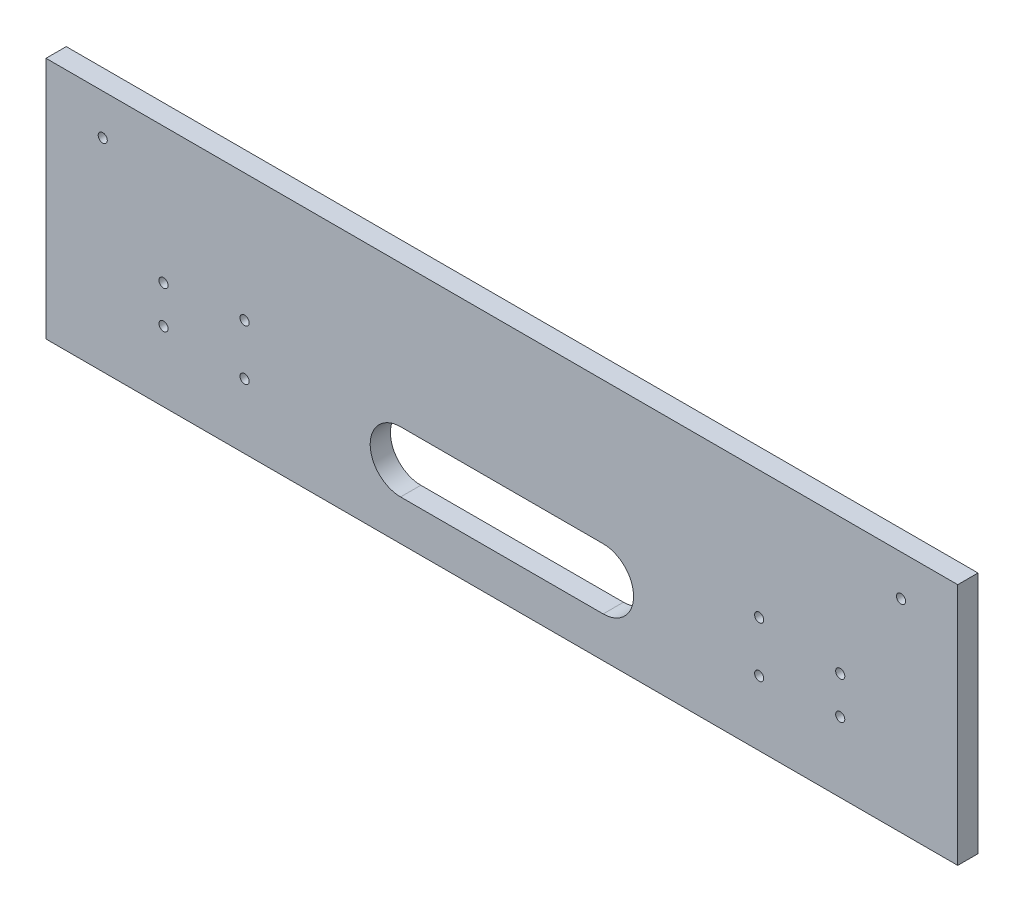
ISO-10303-21;
HEADER;
FILE_DESCRIPTION(('STEP AP214'),'2;1');
FILE_NAME('part.step','',(''),(''),'','','');
FILE_SCHEMA(('AUTOMOTIVE_DESIGN { 1 0 10303 214 1 1 1 1 }'));
ENDSEC;
DATA;
#1=APPLICATION_CONTEXT('core data for automotive mechanical design processes');
#2=APPLICATION_PROTOCOL_DEFINITION('international standard','automotive_design',2000,#1);
#3=PRODUCT_CONTEXT('',#1,'mechanical');
#4=PRODUCT('Part','Part','',(#3));
#5=PRODUCT_RELATED_PRODUCT_CATEGORY('part','',(#4));
#6=PRODUCT_DEFINITION_FORMATION('','',#4);
#7=PRODUCT_DEFINITION_CONTEXT('part definition',#1,'design');
#8=PRODUCT_DEFINITION('design','',#6,#7);
#9=PRODUCT_DEFINITION_SHAPE('','',#8);
#10=(LENGTH_UNIT() NAMED_UNIT(*) SI_UNIT(.MILLI.,.METRE.));
#11=(NAMED_UNIT(*) PLANE_ANGLE_UNIT() SI_UNIT($,.RADIAN.));
#12=(NAMED_UNIT(*) SI_UNIT($,.STERADIAN.) SOLID_ANGLE_UNIT());
#13=UNCERTAINTY_MEASURE_WITH_UNIT(LENGTH_MEASURE(1.E-05),#10,'distance_accuracy_value','');
#14=(GEOMETRIC_REPRESENTATION_CONTEXT(3) GLOBAL_UNCERTAINTY_ASSIGNED_CONTEXT((#13)) GLOBAL_UNIT_ASSIGNED_CONTEXT((#10,
#11,#12)) REPRESENTATION_CONTEXT('',''));
#15=CARTESIAN_POINT('',(0.,0.,0.));
#16=DIRECTION('',(0.,0.,1.));
#17=DIRECTION('',(1.,0.,0.));
#18=AXIS2_PLACEMENT_3D('',#15,#16,#17);
#19=CARTESIAN_POINT('',(-225.,60.,10.));
#20=DIRECTION('',(1.,0.,0.));
#21=DIRECTION('',(0.,0.,-1.));
#22=AXIS2_PLACEMENT_3D('',#19,#20,#21);
#23=PLANE('',#22);
#24=DIRECTION('',(0.,-1.,0.));
#25=VECTOR('',#24,1.);
#26=CARTESIAN_POINT('',(-225.,60.,0.));
#27=LINE('',#26,#25);
#28=CARTESIAN_POINT('',(-225.,60.,0.));
#29=VERTEX_POINT('',#28);
#30=CARTESIAN_POINT('',(-225.,-60.,0.));
#31=VERTEX_POINT('',#30);
#32=EDGE_CURVE('E142',#29,#31,#27,.T.);
#33=ORIENTED_EDGE('',*,*,#32,.T.);
#34=DIRECTION('',(0.,0.,-1.));
#35=VECTOR('',#34,1.);
#36=CARTESIAN_POINT('',(-225.,-60.,10.));
#37=LINE('',#36,#35);
#38=CARTESIAN_POINT('',(-225.,-60.,10.));
#39=VERTEX_POINT('',#38);
#40=EDGE_CURVE('E11',#39,#31,#37,.T.);
#41=ORIENTED_EDGE('',*,*,#40,.F.);
#42=DIRECTION('',(0.,-1.,0.));
#43=VECTOR('',#42,1.);
#44=CARTESIAN_POINT('',(-225.,60.,10.));
#45=LINE('',#44,#43);
#46=CARTESIAN_POINT('',(-225.,60.,10.));
#47=VERTEX_POINT('',#46);
#48=EDGE_CURVE('E146',#47,#39,#45,.T.);
#49=ORIENTED_EDGE('',*,*,#48,.F.);
#50=DIRECTION('',(0.,0.,-1.));
#51=VECTOR('',#50,1.);
#52=CARTESIAN_POINT('',(-225.,60.,10.));
#53=LINE('',#52,#51);
#54=EDGE_CURVE('E156',#47,#29,#53,.T.);
#55=ORIENTED_EDGE('',*,*,#54,.T.);
#56=EDGE_LOOP('',(#33,#41,#49,#55));
#57=FACE_BOUND('',#56,.T.);
#58=ADVANCED_FACE('F41',(#57),#23,.F.);
#59=CARTESIAN_POINT('',(-225.,-60.,10.));
#60=DIRECTION('',(0.,1.,0.));
#61=DIRECTION('',(0.,0.,1.));
#62=AXIS2_PLACEMENT_3D('',#59,#60,#61);
#63=PLANE('',#62);
#64=DIRECTION('',(1.,0.,0.));
#65=VECTOR('',#64,1.);
#66=CARTESIAN_POINT('',(-225.,-60.,0.));
#67=LINE('',#66,#65);
#68=CARTESIAN_POINT('',(225.,-60.,0.));
#69=VERTEX_POINT('',#68);
#70=EDGE_CURVE('E159',#31,#69,#67,.T.);
#71=ORIENTED_EDGE('',*,*,#70,.T.);
#72=DIRECTION('',(0.,0.,-1.));
#73=VECTOR('',#72,1.);
#74=CARTESIAN_POINT('',(225.,-60.,10.));
#75=LINE('',#74,#73);
#76=CARTESIAN_POINT('',(225.,-60.,10.));
#77=VERTEX_POINT('',#76);
#78=EDGE_CURVE('E48',#77,#69,#75,.T.);
#79=ORIENTED_EDGE('',*,*,#78,.F.);
#80=DIRECTION('',(1.,0.,0.));
#81=VECTOR('',#80,1.);
#82=CARTESIAN_POINT('',(-225.,-60.,10.));
#83=LINE('',#82,#81);
#84=EDGE_CURVE('E149',#39,#77,#83,.T.);
#85=ORIENTED_EDGE('',*,*,#84,.F.);
#86=ORIENTED_EDGE('',*,*,#40,.T.);
#87=EDGE_LOOP('',(#71,#79,#85,#86));
#88=FACE_BOUND('',#87,.T.);
#89=ADVANCED_FACE('F187',(#88),#63,.F.);
#90=CARTESIAN_POINT('',(225.,60.,10.));
#91=DIRECTION('',(-1.,0.,0.));
#92=DIRECTION('',(0.,-1.,0.));
#93=AXIS2_PLACEMENT_3D('',#90,#91,#92);
#94=PLANE('',#93);
#95=DIRECTION('',(0.,1.,0.));
#96=VECTOR('',#95,1.);
#97=CARTESIAN_POINT('',(225.,60.,0.));
#98=LINE('',#97,#96);
#99=CARTESIAN_POINT('',(225.,60.,0.));
#100=VERTEX_POINT('',#99);
#101=EDGE_CURVE('E161',#69,#100,#98,.T.);
#102=ORIENTED_EDGE('',*,*,#101,.T.);
#103=DIRECTION('',(0.,0.,-1.));
#104=VECTOR('',#103,1.);
#105=CARTESIAN_POINT('',(225.,60.,10.));
#106=LINE('',#105,#104);
#107=CARTESIAN_POINT('',(225.,60.,10.));
#108=VERTEX_POINT('',#107);
#109=EDGE_CURVE('E166',#108,#100,#106,.T.);
#110=ORIENTED_EDGE('',*,*,#109,.F.);
#111=DIRECTION('',(0.,1.,0.));
#112=VECTOR('',#111,1.);
#113=CARTESIAN_POINT('',(225.,60.,10.));
#114=LINE('',#113,#112);
#115=EDGE_CURVE('E152',#77,#108,#114,.T.);
#116=ORIENTED_EDGE('',*,*,#115,.F.);
#117=ORIENTED_EDGE('',*,*,#78,.T.);
#118=EDGE_LOOP('',(#102,#110,#116,#117));
#119=FACE_BOUND('',#118,.T.);
#120=ADVANCED_FACE('F173',(#119),#94,.F.);
#121=CARTESIAN_POINT('',(-225.,60.,10.));
#122=DIRECTION('',(0.,-1.,0.));
#123=DIRECTION('',(0.,0.,-1.));
#124=AXIS2_PLACEMENT_3D('',#121,#122,#123);
#125=PLANE('',#124);
#126=DIRECTION('',(-1.,0.,0.));
#127=VECTOR('',#126,1.);
#128=CARTESIAN_POINT('',(-225.,60.,0.));
#129=LINE('',#128,#127);
#130=EDGE_CURVE('E150',#100,#29,#129,.T.);
#131=ORIENTED_EDGE('',*,*,#130,.T.);
#132=ORIENTED_EDGE('',*,*,#54,.F.);
#133=DIRECTION('',(-1.,0.,0.));
#134=VECTOR('',#133,1.);
#135=CARTESIAN_POINT('',(-225.,60.,10.));
#136=LINE('',#135,#134);
#137=EDGE_CURVE('E154',#108,#47,#136,.T.);
#138=ORIENTED_EDGE('',*,*,#137,.F.);
#139=ORIENTED_EDGE('',*,*,#109,.T.);
#140=EDGE_LOOP('',(#131,#132,#138,#139));
#141=FACE_BOUND('',#140,.T.);
#142=ADVANCED_FACE('F182',(#141),#125,.F.);
#143=CARTESIAN_POINT('',(0.,0.,10.));
#144=DIRECTION('',(0.,0.,1.));
#145=DIRECTION('',(1.,0.,0.));
#146=AXIS2_PLACEMENT_3D('',#143,#144,#145);
#147=PLANE('',#146);
#148=CARTESIAN_POINT('',(-127.,-3.,10.));
#149=DIRECTION('',(0.,0.,-1.));
#150=DIRECTION('',(-1.,0.,0.));
#151=AXIS2_PLACEMENT_3D('',#148,#149,#150);
#152=CIRCLE('',#151,2.25000000000001);
#153=CARTESIAN_POINT('',(-129.25,-3.,10.));
#154=VERTEX_POINT('',#153);
#155=EDGE_CURVE('E279',#154,#154,#152,.T.);
#156=ORIENTED_EDGE('',*,*,#155,.T.);
#157=EDGE_LOOP('',(#156));
#158=FACE_BOUND('',#157,.T.);
#159=CARTESIAN_POINT('',(-127.,-28.,10.));
#160=DIRECTION('',(0.,0.,-1.));
#161=DIRECTION('',(-1.,0.,0.));
#162=AXIS2_PLACEMENT_3D('',#159,#160,#161);
#163=CIRCLE('',#162,2.25000000000001);
#164=CARTESIAN_POINT('',(-129.25,-28.,10.));
#165=VERTEX_POINT('',#164);
#166=EDGE_CURVE('E273',#165,#165,#163,.T.);
#167=ORIENTED_EDGE('',*,*,#166,.T.);
#168=EDGE_LOOP('',(#167));
#169=FACE_BOUND('',#168,.T.);
#170=CARTESIAN_POINT('',(127.,-28.,10.));
#171=DIRECTION('',(0.,0.,-1.));
#172=DIRECTION('',(-1.,0.,0.));
#173=AXIS2_PLACEMENT_3D('',#170,#171,#172);
#174=CIRCLE('',#173,2.25000000000001);
#175=CARTESIAN_POINT('',(124.75,-28.,10.));
#176=VERTEX_POINT('',#175);
#177=EDGE_CURVE('E258',#176,#176,#174,.T.);
#178=ORIENTED_EDGE('',*,*,#177,.T.);
#179=EDGE_LOOP('',(#178));
#180=FACE_BOUND('',#179,.T.);
#181=CARTESIAN_POINT('',(127.,-3.,10.));
#182=DIRECTION('',(0.,0.,-1.));
#183=DIRECTION('',(-1.,0.,0.));
#184=AXIS2_PLACEMENT_3D('',#181,#182,#183);
#185=CIRCLE('',#184,2.25000000000001);
#186=CARTESIAN_POINT('',(124.75,-3.,10.));
#187=VERTEX_POINT('',#186);
#188=EDGE_CURVE('E266',#187,#187,#185,.T.);
#189=ORIENTED_EDGE('',*,*,#188,.T.);
#190=EDGE_LOOP('',(#189));
#191=FACE_BOUND('',#190,.T.);
#192=CARTESIAN_POINT('',(-197.,40.0000000000001,10.));
#193=DIRECTION('',(0.,0.,1.));
#194=DIRECTION('',(1.,0.,0.));
#195=AXIS2_PLACEMENT_3D('',#192,#193,#194);
#196=CIRCLE('',#195,2.25000000000001);
#197=CARTESIAN_POINT('',(-194.75,40.0000000000001,10.));
#198=VERTEX_POINT('',#197);
#199=EDGE_CURVE('E298',#198,#198,#196,.T.);
#200=ORIENTED_EDGE('',*,*,#199,.F.);
#201=EDGE_LOOP('',(#200));
#202=FACE_BOUND('',#201,.T.);
#203=CARTESIAN_POINT('',(-167.,-25.5,10.));
#204=DIRECTION('',(0.,0.,1.));
#205=DIRECTION('',(1.,0.,0.));
#206=AXIS2_PLACEMENT_3D('',#203,#204,#205);
#207=CIRCLE('',#206,2.25000000000001);
#208=CARTESIAN_POINT('',(-164.75,-25.5,10.));
#209=VERTEX_POINT('',#208);
#210=EDGE_CURVE('E299',#209,#209,#207,.T.);
#211=ORIENTED_EDGE('',*,*,#210,.F.);
#212=EDGE_LOOP('',(#211));
#213=FACE_BOUND('',#212,.T.);
#214=CARTESIAN_POINT('',(167.,-6.99999999999991,10.));
#215=DIRECTION('',(0.,0.,1.));
#216=DIRECTION('',(1.,0.,0.));
#217=AXIS2_PLACEMENT_3D('',#214,#215,#216);
#218=CIRCLE('',#217,2.25000000000001);
#219=CARTESIAN_POINT('',(169.25,-6.99999999999991,10.));
#220=VERTEX_POINT('',#219);
#221=EDGE_CURVE('E305',#220,#220,#218,.T.);
#222=ORIENTED_EDGE('',*,*,#221,.F.);
#223=EDGE_LOOP('',(#222));
#224=FACE_BOUND('',#223,.T.);
#225=CARTESIAN_POINT('',(167.,-25.4999999999999,10.));
#226=DIRECTION('',(0.,0.,1.));
#227=DIRECTION('',(1.,0.,0.));
#228=AXIS2_PLACEMENT_3D('',#225,#226,#227);
#229=CIRCLE('',#228,2.25000000000001);
#230=CARTESIAN_POINT('',(169.25,-25.4999999999999,10.));
#231=VERTEX_POINT('',#230);
#232=EDGE_CURVE('E285',#231,#231,#229,.T.);
#233=ORIENTED_EDGE('',*,*,#232,.F.);
#234=EDGE_LOOP('',(#233));
#235=FACE_BOUND('',#234,.T.);
#236=CARTESIAN_POINT('',(197.,40.0000000000001,10.));
#237=DIRECTION('',(0.,0.,1.));
#238=DIRECTION('',(1.,0.,0.));
#239=AXIS2_PLACEMENT_3D('',#236,#237,#238);
#240=CIRCLE('',#239,2.25000000000001);
#241=CARTESIAN_POINT('',(199.25,40.0000000000001,10.));
#242=VERTEX_POINT('',#241);
#243=EDGE_CURVE('E292',#242,#242,#240,.T.);
#244=ORIENTED_EDGE('',*,*,#243,.F.);
#245=EDGE_LOOP('',(#244));
#246=FACE_BOUND('',#245,.T.);
#247=CARTESIAN_POINT('',(-167.,-6.99999999999997,10.));
#248=DIRECTION('',(0.,0.,1.));
#249=DIRECTION('',(1.,0.,0.));
#250=AXIS2_PLACEMENT_3D('',#247,#248,#249);
#251=CIRCLE('',#250,2.25000000000001);
#252=CARTESIAN_POINT('',(-164.75,-6.99999999999997,10.));
#253=VERTEX_POINT('',#252);
#254=EDGE_CURVE('E129',#253,#253,#251,.T.);
#255=ORIENTED_EDGE('',*,*,#254,.F.);
#256=EDGE_LOOP('',(#255));
#257=FACE_BOUND('',#256,.T.);
#258=CARTESIAN_POINT('',(50.,-25.,10.));
#259=DIRECTION('',(0.,0.,-1.));
#260=DIRECTION('',(-1.,0.,0.));
#261=AXIS2_PLACEMENT_3D('',#258,#259,#260);
#262=CIRCLE('',#261,15.);
#263=CARTESIAN_POINT('',(50.,-9.99999999999999,10.));
#264=VERTEX_POINT('',#263);
#265=CARTESIAN_POINT('',(50.,-40.,10.));
#266=VERTEX_POINT('',#265);
#267=EDGE_CURVE('E107',#264,#266,#262,.T.);
#268=ORIENTED_EDGE('',*,*,#267,.T.);
#269=DIRECTION('',(-1.,0.,0.));
#270=VECTOR('',#269,1.);
#271=CARTESIAN_POINT('',(50.,-40.,10.));
#272=LINE('',#271,#270);
#273=CARTESIAN_POINT('',(-50.,-40.,10.));
#274=VERTEX_POINT('',#273);
#275=EDGE_CURVE('E116',#266,#274,#272,.T.);
#276=ORIENTED_EDGE('',*,*,#275,.T.);
#277=CARTESIAN_POINT('',(-50.,-25.,10.));
#278=DIRECTION('',(0.,0.,-1.));
#279=DIRECTION('',(-1.,0.,0.));
#280=AXIS2_PLACEMENT_3D('',#277,#278,#279);
#281=CIRCLE('',#280,15.);
#282=CARTESIAN_POINT('',(-50.,-9.99999999999998,10.));
#283=VERTEX_POINT('',#282);
#284=EDGE_CURVE('E55',#274,#283,#281,.T.);
#285=ORIENTED_EDGE('',*,*,#284,.T.);
#286=DIRECTION('',(1.,0.,0.));
#287=VECTOR('',#286,1.);
#288=CARTESIAN_POINT('',(50.,-9.99999999999999,10.));
#289=LINE('',#288,#287);
#290=EDGE_CURVE('E113',#283,#264,#289,.T.);
#291=ORIENTED_EDGE('',*,*,#290,.T.);
#292=EDGE_LOOP('',(#268,#276,#285,#291));
#293=FACE_BOUND('',#292,.T.);
#294=ORIENTED_EDGE('',*,*,#48,.T.);
#295=ORIENTED_EDGE('',*,*,#84,.T.);
#296=ORIENTED_EDGE('',*,*,#115,.T.);
#297=ORIENTED_EDGE('',*,*,#137,.T.);
#298=EDGE_LOOP('',(#294,#295,#296,#297));
#299=FACE_BOUND('',#298,.T.);
#300=ADVANCED_FACE('F120',(#158,#169,#180,#191,#202,#213,#224,#235,#246,#257,#293,#299),#147,.T.);
#301=CARTESIAN_POINT('',(0.,0.,0.));
#302=DIRECTION('',(0.,0.,1.));
#303=DIRECTION('',(1.,0.,0.));
#304=AXIS2_PLACEMENT_3D('',#301,#302,#303);
#305=PLANE('',#304);
#306=CARTESIAN_POINT('',(-127.,-3.,0.));
#307=DIRECTION('',(0.,0.,-1.));
#308=DIRECTION('',(-1.,0.,0.));
#309=AXIS2_PLACEMENT_3D('',#306,#307,#308);
#310=CIRCLE('',#309,2.25000000000001);
#311=CARTESIAN_POINT('',(-129.25,-3.,0.));
#312=VERTEX_POINT('',#311);
#313=EDGE_CURVE('E276',#312,#312,#310,.T.);
#314=ORIENTED_EDGE('',*,*,#313,.F.);
#315=EDGE_LOOP('',(#314));
#316=FACE_BOUND('',#315,.T.);
#317=CARTESIAN_POINT('',(-127.,-28.,0.));
#318=DIRECTION('',(0.,0.,-1.));
#319=DIRECTION('',(-1.,0.,0.));
#320=AXIS2_PLACEMENT_3D('',#317,#318,#319);
#321=CIRCLE('',#320,2.25000000000001);
#322=CARTESIAN_POINT('',(-129.25,-28.,0.));
#323=VERTEX_POINT('',#322);
#324=EDGE_CURVE('E268',#323,#323,#321,.T.);
#325=ORIENTED_EDGE('',*,*,#324,.F.);
#326=EDGE_LOOP('',(#325));
#327=FACE_BOUND('',#326,.T.);
#328=CARTESIAN_POINT('',(127.,-28.,0.));
#329=DIRECTION('',(0.,0.,-1.));
#330=DIRECTION('',(-1.,0.,0.));
#331=AXIS2_PLACEMENT_3D('',#328,#329,#330);
#332=CIRCLE('',#331,2.25000000000001);
#333=CARTESIAN_POINT('',(124.75,-28.,0.));
#334=VERTEX_POINT('',#333);
#335=EDGE_CURVE('E261',#334,#334,#332,.T.);
#336=ORIENTED_EDGE('',*,*,#335,.F.);
#337=EDGE_LOOP('',(#336));
#338=FACE_BOUND('',#337,.T.);
#339=CARTESIAN_POINT('',(127.,-3.,0.));
#340=DIRECTION('',(0.,0.,-1.));
#341=DIRECTION('',(-1.,0.,0.));
#342=AXIS2_PLACEMENT_3D('',#339,#340,#341);
#343=CIRCLE('',#342,2.25000000000001);
#344=CARTESIAN_POINT('',(124.75,-3.,0.));
#345=VERTEX_POINT('',#344);
#346=EDGE_CURVE('E263',#345,#345,#343,.T.);
#347=ORIENTED_EDGE('',*,*,#346,.F.);
#348=EDGE_LOOP('',(#347));
#349=FACE_BOUND('',#348,.T.);
#350=CARTESIAN_POINT('',(-197.,40.0000000000001,0.));
#351=DIRECTION('',(0.,0.,1.));
#352=DIRECTION('',(1.,0.,0.));
#353=AXIS2_PLACEMENT_3D('',#350,#351,#352);
#354=CIRCLE('',#353,2.25000000000001);
#355=CARTESIAN_POINT('',(-194.75,40.0000000000001,0.));
#356=VERTEX_POINT('',#355);
#357=EDGE_CURVE('E283',#356,#356,#354,.T.);
#358=ORIENTED_EDGE('',*,*,#357,.T.);
#359=EDGE_LOOP('',(#358));
#360=FACE_BOUND('',#359,.T.);
#361=CARTESIAN_POINT('',(-167.,-25.5,0.));
#362=DIRECTION('',(0.,0.,1.));
#363=DIRECTION('',(1.,0.,0.));
#364=AXIS2_PLACEMENT_3D('',#361,#362,#363);
#365=CIRCLE('',#364,2.25000000000001);
#366=CARTESIAN_POINT('',(-164.75,-25.5,0.));
#367=VERTEX_POINT('',#366);
#368=EDGE_CURVE('E302',#367,#367,#365,.T.);
#369=ORIENTED_EDGE('',*,*,#368,.T.);
#370=EDGE_LOOP('',(#369));
#371=FACE_BOUND('',#370,.T.);
#372=CARTESIAN_POINT('',(167.,-6.99999999999991,0.));
#373=DIRECTION('',(0.,0.,1.));
#374=DIRECTION('',(1.,0.,0.));
#375=AXIS2_PLACEMENT_3D('',#372,#373,#374);
#376=CIRCLE('',#375,2.25000000000001);
#377=CARTESIAN_POINT('',(169.25,-6.99999999999991,0.));
#378=VERTEX_POINT('',#377);
#379=EDGE_CURVE('E288',#378,#378,#376,.T.);
#380=ORIENTED_EDGE('',*,*,#379,.T.);
#381=EDGE_LOOP('',(#380));
#382=FACE_BOUND('',#381,.T.);
#383=CARTESIAN_POINT('',(167.,-25.4999999999999,0.));
#384=DIRECTION('',(0.,0.,1.));
#385=DIRECTION('',(1.,0.,0.));
#386=AXIS2_PLACEMENT_3D('',#383,#384,#385);
#387=CIRCLE('',#386,2.25000000000001);
#388=CARTESIAN_POINT('',(169.25,-25.4999999999999,0.));
#389=VERTEX_POINT('',#388);
#390=EDGE_CURVE('E289',#389,#389,#387,.T.);
#391=ORIENTED_EDGE('',*,*,#390,.T.);
#392=EDGE_LOOP('',(#391));
#393=FACE_BOUND('',#392,.T.);
#394=CARTESIAN_POINT('',(197.,40.0000000000001,0.));
#395=DIRECTION('',(0.,0.,1.));
#396=DIRECTION('',(1.,0.,0.));
#397=AXIS2_PLACEMENT_3D('',#394,#395,#396);
#398=CIRCLE('',#397,2.25000000000001);
#399=CARTESIAN_POINT('',(199.25,40.0000000000001,0.));
#400=VERTEX_POINT('',#399);
#401=EDGE_CURVE('E295',#400,#400,#398,.T.);
#402=ORIENTED_EDGE('',*,*,#401,.T.);
#403=EDGE_LOOP('',(#402));
#404=FACE_BOUND('',#403,.T.);
#405=CARTESIAN_POINT('',(-167.,-6.99999999999997,0.));
#406=DIRECTION('',(0.,0.,1.));
#407=DIRECTION('',(1.,0.,0.));
#408=AXIS2_PLACEMENT_3D('',#405,#406,#407);
#409=CIRCLE('',#408,2.25000000000001);
#410=CARTESIAN_POINT('',(-164.75,-6.99999999999997,0.));
#411=VERTEX_POINT('',#410);
#412=EDGE_CURVE('E136',#411,#411,#409,.T.);
#413=ORIENTED_EDGE('',*,*,#412,.T.);
#414=EDGE_LOOP('',(#413));
#415=FACE_BOUND('',#414,.T.);
#416=DIRECTION('',(-1.,0.,0.));
#417=VECTOR('',#416,1.);
#418=CARTESIAN_POINT('',(50.,-40.,0.));
#419=LINE('',#418,#417);
#420=CARTESIAN_POINT('',(50.,-40.,0.));
#421=VERTEX_POINT('',#420);
#422=CARTESIAN_POINT('',(-50.,-40.,0.));
#423=VERTEX_POINT('',#422);
#424=EDGE_CURVE('E135',#421,#423,#419,.T.);
#425=ORIENTED_EDGE('',*,*,#424,.F.);
#426=CARTESIAN_POINT('',(50.,-25.,0.));
#427=DIRECTION('',(0.,0.,-1.));
#428=DIRECTION('',(-1.,0.,0.));
#429=AXIS2_PLACEMENT_3D('',#426,#427,#428);
#430=CIRCLE('',#429,15.);
#431=CARTESIAN_POINT('',(50.,-9.99999999999999,0.));
#432=VERTEX_POINT('',#431);
#433=EDGE_CURVE('E63',#432,#421,#430,.T.);
#434=ORIENTED_EDGE('',*,*,#433,.F.);
#435=DIRECTION('',(1.,0.,0.));
#436=VECTOR('',#435,1.);
#437=CARTESIAN_POINT('',(50.,-9.99999999999999,0.));
#438=LINE('',#437,#436);
#439=CARTESIAN_POINT('',(-50.,-9.99999999999998,0.));
#440=VERTEX_POINT('',#439);
#441=EDGE_CURVE('E123',#440,#432,#438,.T.);
#442=ORIENTED_EDGE('',*,*,#441,.F.);
#443=CARTESIAN_POINT('',(-50.,-25.,0.));
#444=DIRECTION('',(0.,0.,-1.));
#445=DIRECTION('',(-1.,0.,0.));
#446=AXIS2_PLACEMENT_3D('',#443,#444,#445);
#447=CIRCLE('',#446,15.);
#448=EDGE_CURVE('E126',#423,#440,#447,.T.);
#449=ORIENTED_EDGE('',*,*,#448,.F.);
#450=EDGE_LOOP('',(#425,#434,#442,#449));
#451=FACE_BOUND('',#450,.T.);
#452=ORIENTED_EDGE('',*,*,#32,.F.);
#453=ORIENTED_EDGE('',*,*,#130,.F.);
#454=ORIENTED_EDGE('',*,*,#101,.F.);
#455=ORIENTED_EDGE('',*,*,#70,.F.);
#456=EDGE_LOOP('',(#452,#453,#454,#455));
#457=FACE_BOUND('',#456,.T.);
#458=ADVANCED_FACE('F179',(#316,#327,#338,#349,#360,#371,#382,#393,#404,#415,#451,#457),#305,.F.);
#459=CARTESIAN_POINT('',(50.,-25.,10.));
#460=DIRECTION('',(0.,0.,-1.));
#461=DIRECTION('',(-1.,0.,0.));
#462=AXIS2_PLACEMENT_3D('',#459,#460,#461);
#463=CYLINDRICAL_SURFACE('',#462,15.);
#464=ORIENTED_EDGE('',*,*,#433,.T.);
#465=DIRECTION('',(0.,0.,-1.));
#466=VECTOR('',#465,1.);
#467=CARTESIAN_POINT('',(50.,-40.,10.));
#468=LINE('',#467,#466);
#469=EDGE_CURVE('E103',#266,#421,#468,.T.);
#470=ORIENTED_EDGE('',*,*,#469,.F.);
#471=ORIENTED_EDGE('',*,*,#267,.F.);
#472=DIRECTION('',(0.,0.,-1.));
#473=VECTOR('',#472,1.);
#474=CARTESIAN_POINT('',(50.,-9.99999999999999,10.));
#475=LINE('',#474,#473);
#476=EDGE_CURVE('E140',#264,#432,#475,.T.);
#477=ORIENTED_EDGE('',*,*,#476,.T.);
#478=EDGE_LOOP('',(#464,#470,#471,#477));
#479=FACE_BOUND('',#478,.T.);
#480=ADVANCED_FACE('F105',(#479),#463,.F.);
#481=CARTESIAN_POINT('',(50.,-9.99999999999999,10.));
#482=DIRECTION('',(0.,1.,0.));
#483=DIRECTION('',(-1.,0.,0.));
#484=AXIS2_PLACEMENT_3D('',#481,#482,#483);
#485=PLANE('',#484);
#486=ORIENTED_EDGE('',*,*,#441,.T.);
#487=ORIENTED_EDGE('',*,*,#476,.F.);
#488=ORIENTED_EDGE('',*,*,#290,.F.);
#489=DIRECTION('',(0.,0.,-1.));
#490=VECTOR('',#489,1.);
#491=CARTESIAN_POINT('',(-50.,-9.99999999999998,10.));
#492=LINE('',#491,#490);
#493=EDGE_CURVE('E143',#283,#440,#492,.T.);
#494=ORIENTED_EDGE('',*,*,#493,.T.);
#495=EDGE_LOOP('',(#486,#487,#488,#494));
#496=FACE_BOUND('',#495,.T.);
#497=ADVANCED_FACE('F205',(#496),#485,.F.);
#498=CARTESIAN_POINT('',(-50.,-25.,10.));
#499=DIRECTION('',(0.,0.,-1.));
#500=DIRECTION('',(-1.,0.,0.));
#501=AXIS2_PLACEMENT_3D('',#498,#499,#500);
#502=CYLINDRICAL_SURFACE('',#501,15.);
#503=ORIENTED_EDGE('',*,*,#448,.T.);
#504=ORIENTED_EDGE('',*,*,#493,.F.);
#505=ORIENTED_EDGE('',*,*,#284,.F.);
#506=DIRECTION('',(0.,0.,-1.));
#507=VECTOR('',#506,1.);
#508=CARTESIAN_POINT('',(-50.,-40.,10.));
#509=LINE('',#508,#507);
#510=EDGE_CURVE('E112',#274,#423,#509,.T.);
#511=ORIENTED_EDGE('',*,*,#510,.T.);
#512=EDGE_LOOP('',(#503,#504,#505,#511));
#513=FACE_BOUND('',#512,.T.);
#514=ADVANCED_FACE('F209',(#513),#502,.F.);
#515=CARTESIAN_POINT('',(50.,-40.,10.));
#516=DIRECTION('',(0.,-1.,0.));
#517=DIRECTION('',(1.,0.,0.));
#518=AXIS2_PLACEMENT_3D('',#515,#516,#517);
#519=PLANE('',#518);
#520=ORIENTED_EDGE('',*,*,#424,.T.);
#521=ORIENTED_EDGE('',*,*,#510,.F.);
#522=ORIENTED_EDGE('',*,*,#275,.F.);
#523=ORIENTED_EDGE('',*,*,#469,.T.);
#524=EDGE_LOOP('',(#520,#521,#522,#523));
#525=FACE_BOUND('',#524,.T.);
#526=ADVANCED_FACE('F117',(#525),#519,.F.);
#527=CARTESIAN_POINT('',(-167.,-6.99999999999997,0.));
#528=DIRECTION('',(0.,0.,1.));
#529=DIRECTION('',(1.,0.,0.));
#530=AXIS2_PLACEMENT_3D('',#527,#528,#529);
#531=CYLINDRICAL_SURFACE('',#530,2.25000000000001);
#532=ORIENTED_EDGE('',*,*,#412,.F.);
#533=EDGE_LOOP('',(#532));
#534=FACE_BOUND('',#533,.T.);
#535=ORIENTED_EDGE('',*,*,#254,.T.);
#536=EDGE_LOOP('',(#535));
#537=FACE_BOUND('',#536,.T.);
#538=ADVANCED_FACE('F208',(#534,#537),#531,.F.);
#539=CARTESIAN_POINT('',(197.,40.0000000000001,0.));
#540=DIRECTION('',(0.,0.,1.));
#541=DIRECTION('',(1.,0.,0.));
#542=AXIS2_PLACEMENT_3D('',#539,#540,#541);
#543=CYLINDRICAL_SURFACE('',#542,2.25000000000001);
#544=ORIENTED_EDGE('',*,*,#401,.F.);
#545=EDGE_LOOP('',(#544));
#546=FACE_BOUND('',#545,.T.);
#547=ORIENTED_EDGE('',*,*,#243,.T.);
#548=EDGE_LOOP('',(#547));
#549=FACE_BOUND('',#548,.T.);
#550=ADVANCED_FACE('F217',(#546,#549),#543,.F.);
#551=CARTESIAN_POINT('',(167.,-25.4999999999999,0.));
#552=DIRECTION('',(0.,0.,1.));
#553=DIRECTION('',(1.,0.,0.));
#554=AXIS2_PLACEMENT_3D('',#551,#552,#553);
#555=CYLINDRICAL_SURFACE('',#554,2.25000000000001);
#556=ORIENTED_EDGE('',*,*,#390,.F.);
#557=EDGE_LOOP('',(#556));
#558=FACE_BOUND('',#557,.T.);
#559=ORIENTED_EDGE('',*,*,#232,.T.);
#560=EDGE_LOOP('',(#559));
#561=FACE_BOUND('',#560,.T.);
#562=ADVANCED_FACE('F228',(#558,#561),#555,.F.);
#563=CARTESIAN_POINT('',(167.,-6.99999999999991,0.));
#564=DIRECTION('',(0.,0.,1.));
#565=DIRECTION('',(1.,0.,0.));
#566=AXIS2_PLACEMENT_3D('',#563,#564,#565);
#567=CYLINDRICAL_SURFACE('',#566,2.25000000000001);
#568=ORIENTED_EDGE('',*,*,#379,.F.);
#569=EDGE_LOOP('',(#568));
#570=FACE_BOUND('',#569,.T.);
#571=ORIENTED_EDGE('',*,*,#221,.T.);
#572=EDGE_LOOP('',(#571));
#573=FACE_BOUND('',#572,.T.);
#574=ADVANCED_FACE('F225',(#570,#573),#567,.F.);
#575=CARTESIAN_POINT('',(-167.,-25.5,0.));
#576=DIRECTION('',(0.,0.,1.));
#577=DIRECTION('',(1.,0.,0.));
#578=AXIS2_PLACEMENT_3D('',#575,#576,#577);
#579=CYLINDRICAL_SURFACE('',#578,2.25000000000001);
#580=ORIENTED_EDGE('',*,*,#368,.F.);
#581=EDGE_LOOP('',(#580));
#582=FACE_BOUND('',#581,.T.);
#583=ORIENTED_EDGE('',*,*,#210,.T.);
#584=EDGE_LOOP('',(#583));
#585=FACE_BOUND('',#584,.T.);
#586=ADVANCED_FACE('F223',(#582,#585),#579,.F.);
#587=CARTESIAN_POINT('',(-197.,40.0000000000001,0.));
#588=DIRECTION('',(0.,0.,1.));
#589=DIRECTION('',(1.,0.,0.));
#590=AXIS2_PLACEMENT_3D('',#587,#588,#589);
#591=CYLINDRICAL_SURFACE('',#590,2.25000000000001);
#592=ORIENTED_EDGE('',*,*,#357,.F.);
#593=EDGE_LOOP('',(#592));
#594=FACE_BOUND('',#593,.T.);
#595=ORIENTED_EDGE('',*,*,#199,.T.);
#596=EDGE_LOOP('',(#595));
#597=FACE_BOUND('',#596,.T.);
#598=ADVANCED_FACE('F219',(#594,#597),#591,.F.);
#599=CARTESIAN_POINT('',(127.,-3.,10.));
#600=DIRECTION('',(0.,0.,-1.));
#601=DIRECTION('',(-1.,0.,0.));
#602=AXIS2_PLACEMENT_3D('',#599,#600,#601);
#603=CYLINDRICAL_SURFACE('',#602,2.25000000000001);
#604=ORIENTED_EDGE('',*,*,#188,.F.);
#605=EDGE_LOOP('',(#604));
#606=FACE_BOUND('',#605,.T.);
#607=ORIENTED_EDGE('',*,*,#346,.T.);
#608=EDGE_LOOP('',(#607));
#609=FACE_BOUND('',#608,.T.);
#610=ADVANCED_FACE('F222',(#606,#609),#603,.F.);
#611=CARTESIAN_POINT('',(127.,-28.,10.));
#612=DIRECTION('',(0.,0.,-1.));
#613=DIRECTION('',(-1.,0.,0.));
#614=AXIS2_PLACEMENT_3D('',#611,#612,#613);
#615=CYLINDRICAL_SURFACE('',#614,2.25000000000001);
#616=ORIENTED_EDGE('',*,*,#177,.F.);
#617=EDGE_LOOP('',(#616));
#618=FACE_BOUND('',#617,.T.);
#619=ORIENTED_EDGE('',*,*,#335,.T.);
#620=EDGE_LOOP('',(#619));
#621=FACE_BOUND('',#620,.T.);
#622=ADVANCED_FACE('F241',(#618,#621),#615,.F.);
#623=CARTESIAN_POINT('',(-127.,-28.,10.));
#624=DIRECTION('',(0.,0.,-1.));
#625=DIRECTION('',(-1.,0.,0.));
#626=AXIS2_PLACEMENT_3D('',#623,#624,#625);
#627=CYLINDRICAL_SURFACE('',#626,2.25000000000001);
#628=ORIENTED_EDGE('',*,*,#166,.F.);
#629=EDGE_LOOP('',(#628));
#630=FACE_BOUND('',#629,.T.);
#631=ORIENTED_EDGE('',*,*,#324,.T.);
#632=EDGE_LOOP('',(#631));
#633=FACE_BOUND('',#632,.T.);
#634=ADVANCED_FACE('F246',(#630,#633),#627,.F.);
#635=CARTESIAN_POINT('',(-127.,-3.,10.));
#636=DIRECTION('',(0.,0.,-1.));
#637=DIRECTION('',(-1.,0.,0.));
#638=AXIS2_PLACEMENT_3D('',#635,#636,#637);
#639=CYLINDRICAL_SURFACE('',#638,2.25000000000001);
#640=ORIENTED_EDGE('',*,*,#155,.F.);
#641=EDGE_LOOP('',(#640));
#642=FACE_BOUND('',#641,.T.);
#643=ORIENTED_EDGE('',*,*,#313,.T.);
#644=EDGE_LOOP('',(#643));
#645=FACE_BOUND('',#644,.T.);
#646=ADVANCED_FACE('F243',(#642,#645),#639,.F.);
#647=CLOSED_SHELL('',(#58,#89,#120,#142,#300,#458,#480,#497,#514,#526,#538,#550,#562,#574,#586,
#598,#610,#622,#634,#646));
#648=MANIFOLD_SOLID_BREP('B2',#647);
#649=ADVANCED_BREP_SHAPE_REPRESENTATION('',(#18,#648),#14);
#650=SHAPE_DEFINITION_REPRESENTATION(#9,#649);
ENDSEC;
END-ISO-10303-21;
